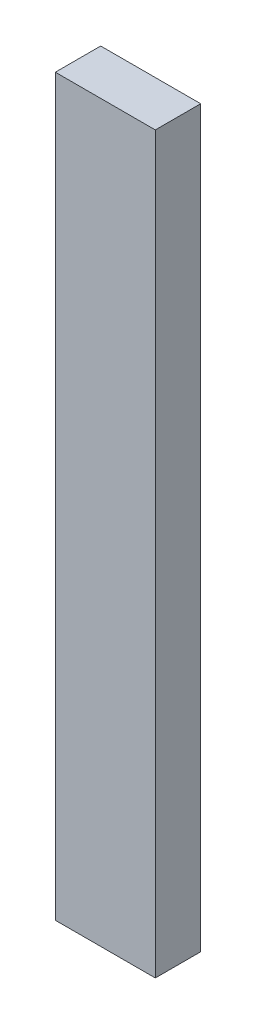
ISO-10303-21;
HEADER;
FILE_DESCRIPTION(('STEP AP214'),'2;1');
FILE_NAME('part.step','',(''),(''),'','','');
FILE_SCHEMA(('AUTOMOTIVE_DESIGN { 1 0 10303 214 1 1 1 1 }'));
ENDSEC;
DATA;
#1=APPLICATION_CONTEXT('core data for automotive mechanical design processes');
#2=APPLICATION_PROTOCOL_DEFINITION('international standard','automotive_design',2000,#1);
#3=PRODUCT_CONTEXT('',#1,'mechanical');
#4=PRODUCT('Part','Part','',(#3));
#5=PRODUCT_RELATED_PRODUCT_CATEGORY('part','',(#4));
#6=PRODUCT_DEFINITION_FORMATION('','',#4);
#7=PRODUCT_DEFINITION_CONTEXT('part definition',#1,'design');
#8=PRODUCT_DEFINITION('design','',#6,#7);
#9=PRODUCT_DEFINITION_SHAPE('','',#8);
#10=(LENGTH_UNIT() NAMED_UNIT(*) SI_UNIT(.MILLI.,.METRE.));
#11=(NAMED_UNIT(*) PLANE_ANGLE_UNIT() SI_UNIT($,.RADIAN.));
#12=(NAMED_UNIT(*) SI_UNIT($,.STERADIAN.) SOLID_ANGLE_UNIT());
#13=UNCERTAINTY_MEASURE_WITH_UNIT(LENGTH_MEASURE(1.E-05),#10,'distance_accuracy_value','');
#14=(GEOMETRIC_REPRESENTATION_CONTEXT(3) GLOBAL_UNCERTAINTY_ASSIGNED_CONTEXT((#13)) GLOBAL_UNIT_ASSIGNED_CONTEXT((#10,
#11,#12)) REPRESENTATION_CONTEXT('',''));
#15=CARTESIAN_POINT('',(0.,0.,0.));
#16=DIRECTION('',(0.,0.,1.));
#17=DIRECTION('',(1.,0.,0.));
#18=AXIS2_PLACEMENT_3D('',#15,#16,#17);
#19=CARTESIAN_POINT('',(0.,396.7,0.));
#20=DIRECTION('',(1.,0.,0.));
#21=DIRECTION('',(0.,0.,-1.));
#22=AXIS2_PLACEMENT_3D('',#19,#20,#21);
#23=PLANE('',#22);
#24=DIRECTION('',(0.,0.,1.));
#25=VECTOR('',#24,1.);
#26=CARTESIAN_POINT('',(0.,0.,0.));
#27=LINE('',#26,#25);
#28=CARTESIAN_POINT('',(0.,0.,-24.5));
#29=VERTEX_POINT('',#28);
#30=CARTESIAN_POINT('',(0.,0.,0.));
#31=VERTEX_POINT('',#30);
#32=EDGE_CURVE('E96',#29,#31,#27,.T.);
#33=ORIENTED_EDGE('',*,*,#32,.T.);
#34=DIRECTION('',(0.,-1.,0.));
#35=VECTOR('',#34,1.);
#36=CARTESIAN_POINT('',(0.,396.7,0.));
#37=LINE('',#36,#35);
#38=CARTESIAN_POINT('',(0.,396.7,0.));
#39=VERTEX_POINT('',#38);
#40=EDGE_CURVE('E11',#39,#31,#37,.T.);
#41=ORIENTED_EDGE('',*,*,#40,.F.);
#42=DIRECTION('',(0.,0.,1.));
#43=VECTOR('',#42,1.);
#44=CARTESIAN_POINT('',(0.,396.7,0.));
#45=LINE('',#44,#43);
#46=CARTESIAN_POINT('',(0.,396.7,-24.5));
#47=VERTEX_POINT('',#46);
#48=EDGE_CURVE('E84',#47,#39,#45,.T.);
#49=ORIENTED_EDGE('',*,*,#48,.F.);
#50=DIRECTION('',(0.,-1.,0.));
#51=VECTOR('',#50,1.);
#52=CARTESIAN_POINT('',(0.,396.7,-24.5));
#53=LINE('',#52,#51);
#54=EDGE_CURVE('E92',#47,#29,#53,.T.);
#55=ORIENTED_EDGE('',*,*,#54,.T.);
#56=EDGE_LOOP('',(#33,#41,#49,#55));
#57=FACE_BOUND('',#56,.T.);
#58=ADVANCED_FACE('F33',(#57),#23,.F.);
#59=CARTESIAN_POINT('',(0.,396.7,0.));
#60=DIRECTION('',(0.,0.,-1.));
#61=DIRECTION('',(-1.,0.,0.));
#62=AXIS2_PLACEMENT_3D('',#59,#60,#61);
#63=PLANE('',#62);
#64=DIRECTION('',(1.,0.,0.));
#65=VECTOR('',#64,1.);
#66=CARTESIAN_POINT('',(0.,0.,0.));
#67=LINE('',#66,#65);
#68=CARTESIAN_POINT('',(54.,0.,0.));
#69=VERTEX_POINT('',#68);
#70=EDGE_CURVE('E88',#31,#69,#67,.T.);
#71=ORIENTED_EDGE('',*,*,#70,.T.);
#72=DIRECTION('',(0.,-1.,0.));
#73=VECTOR('',#72,1.);
#74=CARTESIAN_POINT('',(54.,396.7,0.));
#75=LINE('',#74,#73);
#76=CARTESIAN_POINT('',(54.,396.7,0.));
#77=VERTEX_POINT('',#76);
#78=EDGE_CURVE('E41',#77,#69,#75,.T.);
#79=ORIENTED_EDGE('',*,*,#78,.F.);
#80=DIRECTION('',(1.,0.,0.));
#81=VECTOR('',#80,1.);
#82=CARTESIAN_POINT('',(0.,396.7,0.));
#83=LINE('',#82,#81);
#84=EDGE_CURVE('E79',#39,#77,#83,.T.);
#85=ORIENTED_EDGE('',*,*,#84,.F.);
#86=ORIENTED_EDGE('',*,*,#40,.T.);
#87=EDGE_LOOP('',(#71,#79,#85,#86));
#88=FACE_BOUND('',#87,.T.);
#89=ADVANCED_FACE('F87',(#88),#63,.F.);
#90=CARTESIAN_POINT('',(54.,396.7,0.));
#91=DIRECTION('',(-1.,0.,0.));
#92=DIRECTION('',(0.,0.,1.));
#93=AXIS2_PLACEMENT_3D('',#90,#91,#92);
#94=PLANE('',#93);
#95=DIRECTION('',(0.,0.,-1.));
#96=VECTOR('',#95,1.);
#97=CARTESIAN_POINT('',(54.,0.,0.));
#98=LINE('',#97,#96);
#99=CARTESIAN_POINT('',(54.,0.,-24.5));
#100=VERTEX_POINT('',#99);
#101=EDGE_CURVE('E66',#69,#100,#98,.T.);
#102=ORIENTED_EDGE('',*,*,#101,.T.);
#103=DIRECTION('',(0.,-1.,0.));
#104=VECTOR('',#103,1.);
#105=CARTESIAN_POINT('',(54.,396.7,-24.5));
#106=LINE('',#105,#104);
#107=CARTESIAN_POINT('',(54.,396.7,-24.5));
#108=VERTEX_POINT('',#107);
#109=EDGE_CURVE('E89',#108,#100,#106,.T.);
#110=ORIENTED_EDGE('',*,*,#109,.F.);
#111=DIRECTION('',(0.,0.,-1.));
#112=VECTOR('',#111,1.);
#113=CARTESIAN_POINT('',(54.,396.7,0.));
#114=LINE('',#113,#112);
#115=EDGE_CURVE('E82',#77,#108,#114,.T.);
#116=ORIENTED_EDGE('',*,*,#115,.F.);
#117=ORIENTED_EDGE('',*,*,#78,.T.);
#118=EDGE_LOOP('',(#102,#110,#116,#117));
#119=FACE_BOUND('',#118,.T.);
#120=ADVANCED_FACE('F90',(#119),#94,.F.);
#121=CARTESIAN_POINT('',(0.,396.7,-24.5));
#122=DIRECTION('',(0.,0.,1.));
#123=DIRECTION('',(1.,0.,0.));
#124=AXIS2_PLACEMENT_3D('',#121,#122,#123);
#125=PLANE('',#124);
#126=DIRECTION('',(-1.,0.,0.));
#127=VECTOR('',#126,1.);
#128=CARTESIAN_POINT('',(0.,0.,-24.5));
#129=LINE('',#128,#127);
#130=EDGE_CURVE('E72',#100,#29,#129,.T.);
#131=ORIENTED_EDGE('',*,*,#130,.T.);
#132=ORIENTED_EDGE('',*,*,#54,.F.);
#133=DIRECTION('',(-1.,0.,0.));
#134=VECTOR('',#133,1.);
#135=CARTESIAN_POINT('',(0.,396.7,-24.5));
#136=LINE('',#135,#134);
#137=EDGE_CURVE('E49',#108,#47,#136,.T.);
#138=ORIENTED_EDGE('',*,*,#137,.F.);
#139=ORIENTED_EDGE('',*,*,#109,.T.);
#140=EDGE_LOOP('',(#131,#132,#138,#139));
#141=FACE_BOUND('',#140,.T.);
#142=ADVANCED_FACE('F103',(#141),#125,.F.);
#143=CARTESIAN_POINT('',(0.,396.7,0.));
#144=DIRECTION('',(0.,-1.,0.));
#145=DIRECTION('',(0.,0.,-1.));
#146=AXIS2_PLACEMENT_3D('',#143,#144,#145);
#147=PLANE('',#146);
#148=ORIENTED_EDGE('',*,*,#48,.T.);
#149=ORIENTED_EDGE('',*,*,#84,.T.);
#150=ORIENTED_EDGE('',*,*,#115,.T.);
#151=ORIENTED_EDGE('',*,*,#137,.T.);
#152=EDGE_LOOP('',(#148,#149,#150,#151));
#153=FACE_BOUND('',#152,.T.);
#154=ADVANCED_FACE('F80',(#153),#147,.F.);
#155=CARTESIAN_POINT('',(0.,0.,0.));
#156=DIRECTION('',(0.,-1.,0.));
#157=DIRECTION('',(0.,0.,-1.));
#158=AXIS2_PLACEMENT_3D('',#155,#156,#157);
#159=PLANE('',#158);
#160=ORIENTED_EDGE('',*,*,#32,.F.);
#161=ORIENTED_EDGE('',*,*,#130,.F.);
#162=ORIENTED_EDGE('',*,*,#101,.F.);
#163=ORIENTED_EDGE('',*,*,#70,.F.);
#164=EDGE_LOOP('',(#160,#161,#162,#163));
#165=FACE_BOUND('',#164,.T.);
#166=ADVANCED_FACE('F106',(#165),#159,.T.);
#167=CLOSED_SHELL('',(#58,#89,#120,#142,#154,#166));
#168=MANIFOLD_SOLID_BREP('B2',#167);
#169=ADVANCED_BREP_SHAPE_REPRESENTATION('',(#18,#168),#14);
#170=SHAPE_DEFINITION_REPRESENTATION(#9,#169);
ENDSEC;
END-ISO-10303-21;
